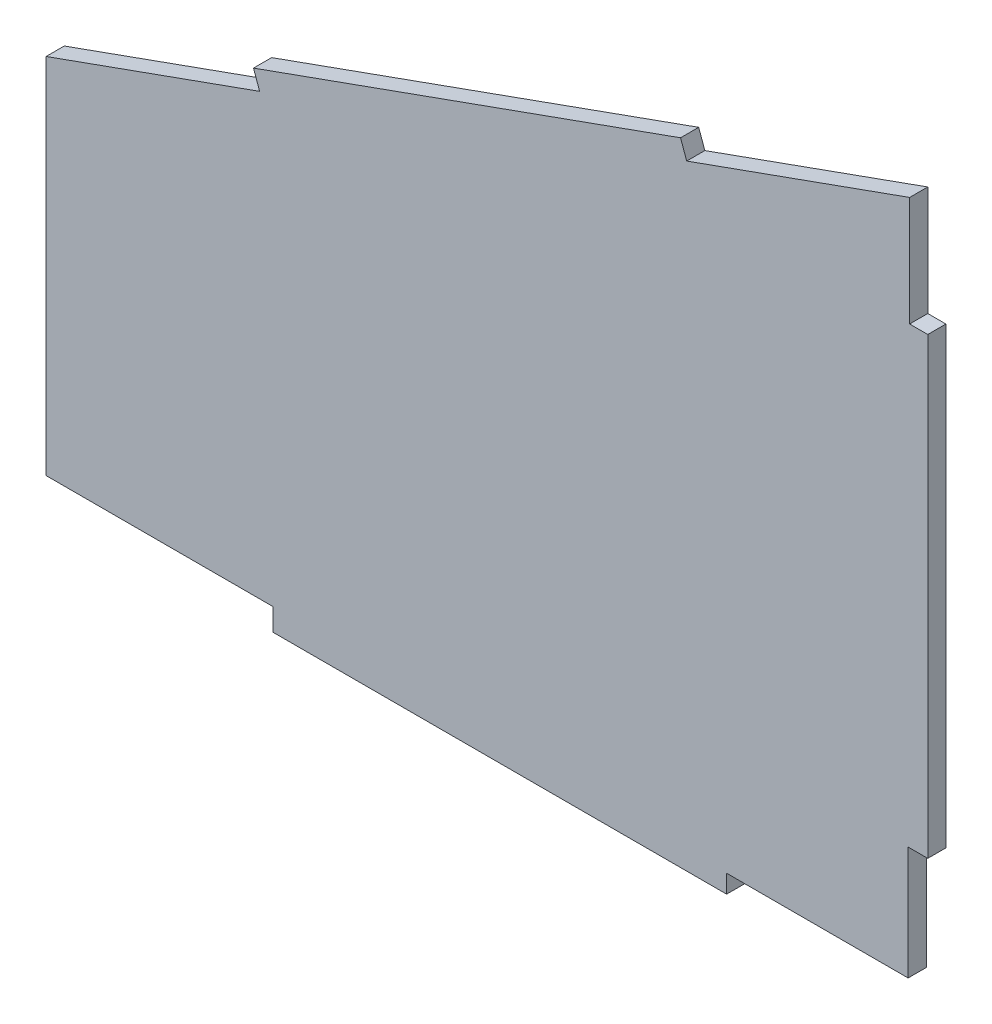
ISO-10303-21;
HEADER;
FILE_DESCRIPTION(('STEP AP214'),'2;1');
FILE_NAME('part.step','',(''),(''),'','','');
FILE_SCHEMA(('AUTOMOTIVE_DESIGN { 1 0 10303 214 1 1 1 1 }'));
ENDSEC;
DATA;
#1=APPLICATION_CONTEXT('core data for automotive mechanical design processes');
#2=APPLICATION_PROTOCOL_DEFINITION('international standard','automotive_design',2000,#1);
#3=PRODUCT_CONTEXT('',#1,'mechanical');
#4=PRODUCT('Part','Part','',(#3));
#5=PRODUCT_RELATED_PRODUCT_CATEGORY('part','',(#4));
#6=PRODUCT_DEFINITION_FORMATION('','',#4);
#7=PRODUCT_DEFINITION_CONTEXT('part definition',#1,'design');
#8=PRODUCT_DEFINITION('design','',#6,#7);
#9=PRODUCT_DEFINITION_SHAPE('','',#8);
#10=(LENGTH_UNIT() NAMED_UNIT(*) SI_UNIT(.MILLI.,.METRE.));
#11=(NAMED_UNIT(*) PLANE_ANGLE_UNIT() SI_UNIT($,.RADIAN.));
#12=(NAMED_UNIT(*) SI_UNIT($,.STERADIAN.) SOLID_ANGLE_UNIT());
#13=UNCERTAINTY_MEASURE_WITH_UNIT(LENGTH_MEASURE(1.E-05),#10,'distance_accuracy_value','');
#14=(GEOMETRIC_REPRESENTATION_CONTEXT(3) GLOBAL_UNCERTAINTY_ASSIGNED_CONTEXT((#13)) GLOBAL_UNIT_ASSIGNED_CONTEXT((#10,
#11,#12)) REPRESENTATION_CONTEXT('',''));
#15=CARTESIAN_POINT('',(0.,0.,0.));
#16=DIRECTION('',(0.,0.,1.));
#17=DIRECTION('',(1.,0.,0.));
#18=AXIS2_PLACEMENT_3D('',#15,#16,#17);
#19=CARTESIAN_POINT('',(-41.4083095907315,11.0698668127962,2.));
#20=DIRECTION('',(0.3375865479723,-0.94129449304038,0.));
#21=DIRECTION('',(0.94129449304038,0.3375865479723,0.));
#22=AXIS2_PLACEMENT_3D('',#19,#20,#21);
#23=PLANE('',#22);
#24=DIRECTION('',(-0.94129449304038,-0.3375865479723,0.));
#25=VECTOR('',#24,1.);
#26=CARTESIAN_POINT('',(-41.4083095907315,11.0698668127962,0.));
#27=LINE('',#26,#25);
#28=CARTESIAN_POINT('',(-41.4083095907315,11.0698668127962,0.));
#29=VERTEX_POINT('',#28);
#30=CARTESIAN_POINT('',(-64.9406719167412,2.63020311348861,0.));
#31=VERTEX_POINT('',#30);
#32=EDGE_CURVE('E180',#29,#31,#27,.T.);
#33=ORIENTED_EDGE('',*,*,#32,.T.);
#34=DIRECTION('',(0.,0.,-1.));
#35=VECTOR('',#34,1.);
#36=CARTESIAN_POINT('',(-64.9406719167412,2.63020311348861,2.));
#37=LINE('',#36,#35);
#38=CARTESIAN_POINT('',(-64.9406719167412,2.63020311348861,2.));
#39=VERTEX_POINT('',#38);
#40=EDGE_CURVE('E11',#39,#31,#37,.T.);
#41=ORIENTED_EDGE('',*,*,#40,.F.);
#42=DIRECTION('',(-0.94129449304038,-0.3375865479723,0.));
#43=VECTOR('',#42,1.);
#44=CARTESIAN_POINT('',(-41.4083095907315,11.0698668127962,2.));
#45=LINE('',#44,#43);
#46=CARTESIAN_POINT('',(-41.4083095907315,11.0698668127962,2.));
#47=VERTEX_POINT('',#46);
#48=EDGE_CURVE('E210',#47,#39,#45,.T.);
#49=ORIENTED_EDGE('',*,*,#48,.F.);
#50=DIRECTION('',(0.,0.,-1.));
#51=VECTOR('',#50,1.);
#52=CARTESIAN_POINT('',(-41.4083095907315,11.0698668127962,2.));
#53=LINE('',#52,#51);
#54=EDGE_CURVE('E176',#47,#29,#53,.T.);
#55=ORIENTED_EDGE('',*,*,#54,.T.);
#56=EDGE_LOOP('',(#33,#41,#49,#55));
#57=FACE_BOUND('',#56,.T.);
#58=ADVANCED_FACE('F36',(#57),#23,.F.);
#59=CARTESIAN_POINT('',(-64.9406719167412,2.63020311348861,2.));
#60=DIRECTION('',(1.,0.,0.));
#61=DIRECTION('',(0.,1.,0.));
#62=AXIS2_PLACEMENT_3D('',#59,#60,#61);
#63=PLANE('',#62);
#64=DIRECTION('',(0.,-1.,0.));
#65=VECTOR('',#64,1.);
#66=CARTESIAN_POINT('',(-64.9406719167412,2.63020311348861,0.));
#67=LINE('',#66,#65);
#68=CARTESIAN_POINT('',(-64.9406719167411,-37.3697968865117,0.));
#69=VERTEX_POINT('',#68);
#70=EDGE_CURVE('E183',#31,#69,#67,.T.);
#71=ORIENTED_EDGE('',*,*,#70,.T.);
#72=DIRECTION('',(0.,0.,-1.));
#73=VECTOR('',#72,1.);
#74=CARTESIAN_POINT('',(-64.9406719167411,-37.3697968865117,2.));
#75=LINE('',#74,#73);
#76=CARTESIAN_POINT('',(-64.9406719167411,-37.3697968865117,2.));
#77=VERTEX_POINT('',#76);
#78=EDGE_CURVE('E44',#77,#69,#75,.T.);
#79=ORIENTED_EDGE('',*,*,#78,.F.);
#80=DIRECTION('',(0.,-1.,0.));
#81=VECTOR('',#80,1.);
#82=CARTESIAN_POINT('',(-64.9406719167412,2.63020311348861,2.));
#83=LINE('',#82,#81);
#84=EDGE_CURVE('E119',#39,#77,#83,.T.);
#85=ORIENTED_EDGE('',*,*,#84,.F.);
#86=ORIENTED_EDGE('',*,*,#40,.T.);
#87=EDGE_LOOP('',(#71,#79,#85,#86));
#88=FACE_BOUND('',#87,.T.);
#89=ADVANCED_FACE('F308',(#88),#63,.F.);
#90=CARTESIAN_POINT('',(-64.9406719167411,-37.3697968865117,2.));
#91=DIRECTION('',(0.,1.,0.));
#92=DIRECTION('',(-1.,0.,0.));
#93=AXIS2_PLACEMENT_3D('',#90,#91,#92);
#94=PLANE('',#93);
#95=DIRECTION('',(1.,0.,0.));
#96=VECTOR('',#95,1.);
#97=CARTESIAN_POINT('',(-64.9406719167411,-37.3697968865117,0.));
#98=LINE('',#97,#96);
#99=CARTESIAN_POINT('',(-39.940671916741,-37.3697968865117,0.));
#100=VERTEX_POINT('',#99);
#101=EDGE_CURVE('E185',#69,#100,#98,.T.);
#102=ORIENTED_EDGE('',*,*,#101,.T.);
#103=DIRECTION('',(0.,0.,-1.));
#104=VECTOR('',#103,1.);
#105=CARTESIAN_POINT('',(-39.940671916741,-37.3697968865117,2.));
#106=LINE('',#105,#104);
#107=CARTESIAN_POINT('',(-39.940671916741,-37.3697968865117,2.));
#108=VERTEX_POINT('',#107);
#109=EDGE_CURVE('E241',#108,#100,#106,.T.);
#110=ORIENTED_EDGE('',*,*,#109,.F.);
#111=DIRECTION('',(1.,0.,0.));
#112=VECTOR('',#111,1.);
#113=CARTESIAN_POINT('',(-64.9406719167411,-37.3697968865117,2.));
#114=LINE('',#113,#112);
#115=EDGE_CURVE('E249',#77,#108,#114,.T.);
#116=ORIENTED_EDGE('',*,*,#115,.F.);
#117=ORIENTED_EDGE('',*,*,#78,.T.);
#118=EDGE_LOOP('',(#102,#110,#116,#117));
#119=FACE_BOUND('',#118,.T.);
#120=ADVANCED_FACE('F247',(#119),#94,.F.);
#121=CARTESIAN_POINT('',(-39.940671916741,-37.3697968865117,2.));
#122=DIRECTION('',(1.,0.,0.));
#123=DIRECTION('',(0.,1.,0.));
#124=AXIS2_PLACEMENT_3D('',#121,#122,#123);
#125=PLANE('',#124);
#126=DIRECTION('',(0.,-1.,0.));
#127=VECTOR('',#126,1.);
#128=CARTESIAN_POINT('',(-39.940671916741,-37.3697968865117,0.));
#129=LINE('',#128,#127);
#130=CARTESIAN_POINT('',(-39.940671916741,-39.8197968865117,0.));
#131=VERTEX_POINT('',#130);
#132=EDGE_CURVE('E187',#100,#131,#129,.T.);
#133=ORIENTED_EDGE('',*,*,#132,.T.);
#134=DIRECTION('',(0.,0.,-1.));
#135=VECTOR('',#134,1.);
#136=CARTESIAN_POINT('',(-39.940671916741,-39.8197968865117,2.));
#137=LINE('',#136,#135);
#138=CARTESIAN_POINT('',(-39.940671916741,-39.8197968865117,2.));
#139=VERTEX_POINT('',#138);
#140=EDGE_CURVE('E238',#139,#131,#137,.T.);
#141=ORIENTED_EDGE('',*,*,#140,.F.);
#142=DIRECTION('',(0.,-1.,0.));
#143=VECTOR('',#142,1.);
#144=CARTESIAN_POINT('',(-39.940671916741,-37.3697968865117,2.));
#145=LINE('',#144,#143);
#146=EDGE_CURVE('E267',#108,#139,#145,.T.);
#147=ORIENTED_EDGE('',*,*,#146,.F.);
#148=ORIENTED_EDGE('',*,*,#109,.T.);
#149=EDGE_LOOP('',(#133,#141,#147,#148));
#150=FACE_BOUND('',#149,.T.);
#151=ADVANCED_FACE('F258',(#150),#125,.F.);
#152=CARTESIAN_POINT('',(-39.940671916741,-39.8197968865117,2.));
#153=DIRECTION('',(0.,1.,0.));
#154=DIRECTION('',(0.,0.,1.));
#155=AXIS2_PLACEMENT_3D('',#152,#153,#154);
#156=PLANE('',#155);
#157=DIRECTION('',(1.,0.,0.));
#158=VECTOR('',#157,1.);
#159=CARTESIAN_POINT('',(-39.940671916741,-39.8197968865117,0.));
#160=LINE('',#159,#158);
#161=CARTESIAN_POINT('',(10.059328083259,-39.8197968865117,0.));
#162=VERTEX_POINT('',#161);
#163=EDGE_CURVE('E189',#131,#162,#160,.T.);
#164=ORIENTED_EDGE('',*,*,#163,.T.);
#165=DIRECTION('',(0.,0.,-1.));
#166=VECTOR('',#165,1.);
#167=CARTESIAN_POINT('',(10.059328083259,-39.8197968865117,2.));
#168=LINE('',#167,#166);
#169=CARTESIAN_POINT('',(10.059328083259,-39.8197968865117,2.));
#170=VERTEX_POINT('',#169);
#171=EDGE_CURVE('E235',#170,#162,#168,.T.);
#172=ORIENTED_EDGE('',*,*,#171,.F.);
#173=DIRECTION('',(1.,0.,0.));
#174=VECTOR('',#173,1.);
#175=CARTESIAN_POINT('',(-39.940671916741,-39.8197968865117,2.));
#176=LINE('',#175,#174);
#177=EDGE_CURVE('E264',#139,#170,#176,.T.);
#178=ORIENTED_EDGE('',*,*,#177,.F.);
#179=ORIENTED_EDGE('',*,*,#140,.T.);
#180=EDGE_LOOP('',(#164,#172,#178,#179));
#181=FACE_BOUND('',#180,.T.);
#182=ADVANCED_FACE('F262',(#181),#156,.F.);
#183=CARTESIAN_POINT('',(10.059328083259,-37.8197968865117,2.));
#184=DIRECTION('',(-1.,0.,0.));
#185=DIRECTION('',(0.,0.,1.));
#186=AXIS2_PLACEMENT_3D('',#183,#184,#185);
#187=PLANE('',#186);
#188=DIRECTION('',(0.,1.,0.));
#189=VECTOR('',#188,1.);
#190=CARTESIAN_POINT('',(10.059328083259,-37.8197968865117,0.));
#191=LINE('',#190,#189);
#192=CARTESIAN_POINT('',(10.059328083259,-37.8197968865117,0.));
#193=VERTEX_POINT('',#192);
#194=EDGE_CURVE('E191',#162,#193,#191,.T.);
#195=ORIENTED_EDGE('',*,*,#194,.T.);
#196=DIRECTION('',(0.,0.,-1.));
#197=VECTOR('',#196,1.);
#198=CARTESIAN_POINT('',(10.059328083259,-37.8197968865117,2.));
#199=LINE('',#198,#197);
#200=CARTESIAN_POINT('',(10.059328083259,-37.8197968865117,2.));
#201=VERTEX_POINT('',#200);
#202=EDGE_CURVE('E232',#201,#193,#199,.T.);
#203=ORIENTED_EDGE('',*,*,#202,.F.);
#204=DIRECTION('',(0.,1.,0.));
#205=VECTOR('',#204,1.);
#206=CARTESIAN_POINT('',(10.059328083259,-37.8197968865117,2.));
#207=LINE('',#206,#205);
#208=EDGE_CURVE('E266',#170,#201,#207,.T.);
#209=ORIENTED_EDGE('',*,*,#208,.F.);
#210=ORIENTED_EDGE('',*,*,#171,.T.);
#211=EDGE_LOOP('',(#195,#203,#209,#210));
#212=FACE_BOUND('',#211,.T.);
#213=ADVANCED_FACE('F321',(#212),#187,.F.);
#214=CARTESIAN_POINT('',(10.059328083259,-37.8197968865117,2.));
#215=DIRECTION('',(0.,1.,0.));
#216=DIRECTION('',(-1.,0.,0.));
#217=AXIS2_PLACEMENT_3D('',#214,#215,#216);
#218=PLANE('',#217);
#219=DIRECTION('',(1.,0.,0.));
#220=VECTOR('',#219,1.);
#221=CARTESIAN_POINT('',(10.059328083259,-37.8197968865117,0.));
#222=LINE('',#221,#220);
#223=CARTESIAN_POINT('',(30.059328083259,-37.8197968865116,0.));
#224=VERTEX_POINT('',#223);
#225=EDGE_CURVE('E193',#193,#224,#222,.T.);
#226=ORIENTED_EDGE('',*,*,#225,.T.);
#227=DIRECTION('',(0.,0.,-1.));
#228=VECTOR('',#227,1.);
#229=CARTESIAN_POINT('',(30.059328083259,-37.8197968865116,2.));
#230=LINE('',#229,#228);
#231=CARTESIAN_POINT('',(30.059328083259,-37.8197968865116,2.));
#232=VERTEX_POINT('',#231);
#233=EDGE_CURVE('E229',#232,#224,#230,.T.);
#234=ORIENTED_EDGE('',*,*,#233,.F.);
#235=DIRECTION('',(1.,0.,0.));
#236=VECTOR('',#235,1.);
#237=CARTESIAN_POINT('',(10.059328083259,-37.8197968865117,2.));
#238=LINE('',#237,#236);
#239=EDGE_CURVE('E269',#201,#232,#238,.T.);
#240=ORIENTED_EDGE('',*,*,#239,.F.);
#241=ORIENTED_EDGE('',*,*,#202,.T.);
#242=EDGE_LOOP('',(#226,#234,#240,#241));
#243=FACE_BOUND('',#242,.T.);
#244=ADVANCED_FACE('F324',(#243),#218,.F.);
#245=CARTESIAN_POINT('',(30.059328083259,-37.8197968865116,2.));
#246=DIRECTION('',(-1.,0.,0.));
#247=DIRECTION('',(0.,-1.,0.));
#248=AXIS2_PLACEMENT_3D('',#245,#246,#247);
#249=PLANE('',#248);
#250=DIRECTION('',(0.,1.,0.));
#251=VECTOR('',#250,1.);
#252=CARTESIAN_POINT('',(30.059328083259,-37.8197968865116,0.));
#253=LINE('',#252,#251);
#254=CARTESIAN_POINT('',(30.059328083259,-25.3197968865116,0.));
#255=VERTEX_POINT('',#254);
#256=EDGE_CURVE('E195',#224,#255,#253,.T.);
#257=ORIENTED_EDGE('',*,*,#256,.T.);
#258=DIRECTION('',(0.,0.,-1.));
#259=VECTOR('',#258,1.);
#260=CARTESIAN_POINT('',(30.059328083259,-25.3197968865116,2.));
#261=LINE('',#260,#259);
#262=CARTESIAN_POINT('',(30.059328083259,-25.3197968865116,2.));
#263=VERTEX_POINT('',#262);
#264=EDGE_CURVE('E226',#263,#255,#261,.T.);
#265=ORIENTED_EDGE('',*,*,#264,.F.);
#266=DIRECTION('',(0.,1.,0.));
#267=VECTOR('',#266,1.);
#268=CARTESIAN_POINT('',(30.059328083259,-37.8197968865116,2.));
#269=LINE('',#268,#267);
#270=EDGE_CURVE('E275',#232,#263,#269,.T.);
#271=ORIENTED_EDGE('',*,*,#270,.F.);
#272=ORIENTED_EDGE('',*,*,#233,.T.);
#273=EDGE_LOOP('',(#257,#265,#271,#272));
#274=FACE_BOUND('',#273,.T.);
#275=ADVANCED_FACE('F328',(#274),#249,.F.);
#276=CARTESIAN_POINT('',(30.059328083259,-25.3197968865116,2.));
#277=DIRECTION('',(0.,1.,0.));
#278=DIRECTION('',(-1.,0.,0.));
#279=AXIS2_PLACEMENT_3D('',#276,#277,#278);
#280=PLANE('',#279);
#281=DIRECTION('',(1.,0.,0.));
#282=VECTOR('',#281,1.);
#283=CARTESIAN_POINT('',(30.059328083259,-25.3197968865116,0.));
#284=LINE('',#283,#282);
#285=CARTESIAN_POINT('',(32.2242013296412,-25.3197968865116,0.));
#286=VERTEX_POINT('',#285);
#287=EDGE_CURVE('E197',#255,#286,#284,.T.);
#288=ORIENTED_EDGE('',*,*,#287,.T.);
#289=DIRECTION('',(0.,0.,-1.));
#290=VECTOR('',#289,1.);
#291=CARTESIAN_POINT('',(32.2242013296412,-25.3197968865116,2.));
#292=LINE('',#291,#290);
#293=CARTESIAN_POINT('',(32.2242013296412,-25.3197968865116,2.));
#294=VERTEX_POINT('',#293);
#295=EDGE_CURVE('E223',#294,#286,#292,.T.);
#296=ORIENTED_EDGE('',*,*,#295,.F.);
#297=DIRECTION('',(1.,0.,0.));
#298=VECTOR('',#297,1.);
#299=CARTESIAN_POINT('',(30.059328083259,-25.3197968865116,2.));
#300=LINE('',#299,#298);
#301=EDGE_CURVE('E277',#263,#294,#300,.T.);
#302=ORIENTED_EDGE('',*,*,#301,.F.);
#303=ORIENTED_EDGE('',*,*,#264,.T.);
#304=EDGE_LOOP('',(#288,#296,#302,#303));
#305=FACE_BOUND('',#304,.T.);
#306=ADVANCED_FACE('F332',(#305),#280,.F.);
#307=CARTESIAN_POINT('',(32.2242013296412,24.6802031134884,2.));
#308=DIRECTION('',(-1.,0.,0.));
#309=DIRECTION('',(0.,-1.,0.));
#310=AXIS2_PLACEMENT_3D('',#307,#308,#309);
#311=PLANE('',#310);
#312=DIRECTION('',(0.,1.,0.));
#313=VECTOR('',#312,1.);
#314=CARTESIAN_POINT('',(32.2242013296412,24.6802031134884,0.));
#315=LINE('',#314,#313);
#316=CARTESIAN_POINT('',(32.2242013296412,24.6802031134884,0.));
#317=VERTEX_POINT('',#316);
#318=EDGE_CURVE('E199',#286,#317,#315,.T.);
#319=ORIENTED_EDGE('',*,*,#318,.T.);
#320=DIRECTION('',(0.,0.,-1.));
#321=VECTOR('',#320,1.);
#322=CARTESIAN_POINT('',(32.2242013296412,24.6802031134884,2.));
#323=LINE('',#322,#321);
#324=CARTESIAN_POINT('',(32.2242013296412,24.6802031134884,2.));
#325=VERTEX_POINT('',#324);
#326=EDGE_CURVE('E220',#325,#317,#323,.T.);
#327=ORIENTED_EDGE('',*,*,#326,.F.);
#328=DIRECTION('',(0.,1.,0.));
#329=VECTOR('',#328,1.);
#330=CARTESIAN_POINT('',(32.2242013296412,24.6802031134884,2.));
#331=LINE('',#330,#329);
#332=EDGE_CURVE('E279',#294,#325,#331,.T.);
#333=ORIENTED_EDGE('',*,*,#332,.F.);
#334=ORIENTED_EDGE('',*,*,#295,.T.);
#335=EDGE_LOOP('',(#319,#327,#333,#334));
#336=FACE_BOUND('',#335,.T.);
#337=ADVANCED_FACE('F336',(#336),#311,.F.);
#338=CARTESIAN_POINT('',(30.2242013296412,24.6802031134884,2.));
#339=DIRECTION('',(0.,-1.,0.));
#340=DIRECTION('',(0.,0.,-1.));
#341=AXIS2_PLACEMENT_3D('',#338,#339,#340);
#342=PLANE('',#341);
#343=DIRECTION('',(-1.,0.,0.));
#344=VECTOR('',#343,1.);
#345=CARTESIAN_POINT('',(30.2242013296412,24.6802031134884,0.));
#346=LINE('',#345,#344);
#347=CARTESIAN_POINT('',(30.2242013296412,24.6802031134884,0.));
#348=VERTEX_POINT('',#347);
#349=EDGE_CURVE('E201',#317,#348,#346,.T.);
#350=ORIENTED_EDGE('',*,*,#349,.T.);
#351=DIRECTION('',(0.,0.,-1.));
#352=VECTOR('',#351,1.);
#353=CARTESIAN_POINT('',(30.2242013296412,24.6802031134884,2.));
#354=LINE('',#353,#352);
#355=CARTESIAN_POINT('',(30.2242013296412,24.6802031134884,2.));
#356=VERTEX_POINT('',#355);
#357=EDGE_CURVE('E217',#356,#348,#354,.T.);
#358=ORIENTED_EDGE('',*,*,#357,.F.);
#359=DIRECTION('',(-1.,0.,0.));
#360=VECTOR('',#359,1.);
#361=CARTESIAN_POINT('',(30.2242013296412,24.6802031134884,2.));
#362=LINE('',#361,#360);
#363=EDGE_CURVE('E281',#325,#356,#362,.T.);
#364=ORIENTED_EDGE('',*,*,#363,.F.);
#365=ORIENTED_EDGE('',*,*,#326,.T.);
#366=EDGE_LOOP('',(#350,#358,#364,#365));
#367=FACE_BOUND('',#366,.T.);
#368=ADVANCED_FACE('F340',(#367),#342,.F.);
#369=CARTESIAN_POINT('',(30.2242013296412,24.6802031134884,2.));
#370=DIRECTION('',(-1.,0.,0.));
#371=DIRECTION('',(0.,0.,1.));
#372=AXIS2_PLACEMENT_3D('',#369,#370,#371);
#373=PLANE('',#372);
#374=DIRECTION('',(0.,1.,0.));
#375=VECTOR('',#374,1.);
#376=CARTESIAN_POINT('',(30.2242013296412,24.6802031134884,0.));
#377=LINE('',#376,#375);
#378=CARTESIAN_POINT('',(30.2242013296412,36.7602031134884,0.));
#379=VERTEX_POINT('',#378);
#380=EDGE_CURVE('E203',#348,#379,#377,.T.);
#381=ORIENTED_EDGE('',*,*,#380,.T.);
#382=DIRECTION('',(0.,0.,-1.));
#383=VECTOR('',#382,1.);
#384=CARTESIAN_POINT('',(30.2242013296412,36.7602031134884,2.));
#385=LINE('',#384,#383);
#386=CARTESIAN_POINT('',(30.2242013296412,36.7602031134884,2.));
#387=VERTEX_POINT('',#386);
#388=EDGE_CURVE('E214',#387,#379,#385,.T.);
#389=ORIENTED_EDGE('',*,*,#388,.F.);
#390=DIRECTION('',(0.,1.,0.));
#391=VECTOR('',#390,1.);
#392=CARTESIAN_POINT('',(30.2242013296412,24.6802031134884,2.));
#393=LINE('',#392,#391);
#394=EDGE_CURVE('E283',#356,#387,#393,.T.);
#395=ORIENTED_EDGE('',*,*,#394,.F.);
#396=ORIENTED_EDGE('',*,*,#357,.T.);
#397=EDGE_LOOP('',(#381,#389,#395,#396));
#398=FACE_BOUND('',#397,.T.);
#399=ADVANCED_FACE('F289',(#398),#373,.F.);
#400=CARTESIAN_POINT('',(30.2242013296412,36.7602031134884,2.));
#401=DIRECTION('',(0.337586547972305,-0.941294493040378,0.));
#402=DIRECTION('',(0.941294493040378,0.337586547972305,0.));
#403=AXIS2_PLACEMENT_3D('',#400,#401,#402);
#404=PLANE('',#403);
#405=DIRECTION('',(-0.941294493040378,-0.337586547972305,0.));
#406=VECTOR('',#405,1.);
#407=CARTESIAN_POINT('',(30.2242013296412,36.7602031134884,0.));
#408=LINE('',#407,#406);
#409=CARTESIAN_POINT('',(5.65641506128749,27.9491942114112,0.));
#410=VERTEX_POINT('',#409);
#411=EDGE_CURVE('E205',#379,#410,#408,.T.);
#412=ORIENTED_EDGE('',*,*,#411,.T.);
#413=DIRECTION('',(0.,0.,-1.));
#414=VECTOR('',#413,1.);
#415=CARTESIAN_POINT('',(5.65641506128749,27.9491942114112,2.));
#416=LINE('',#415,#414);
#417=CARTESIAN_POINT('',(5.65641506128749,27.9491942114112,2.));
#418=VERTEX_POINT('',#417);
#419=EDGE_CURVE('E171',#418,#410,#416,.T.);
#420=ORIENTED_EDGE('',*,*,#419,.F.);
#421=DIRECTION('',(-0.941294493040378,-0.337586547972305,0.));
#422=VECTOR('',#421,1.);
#423=CARTESIAN_POINT('',(30.2242013296412,36.7602031134884,2.));
#424=LINE('',#423,#422);
#425=EDGE_CURVE('E162',#387,#418,#424,.T.);
#426=ORIENTED_EDGE('',*,*,#425,.F.);
#427=ORIENTED_EDGE('',*,*,#388,.T.);
#428=EDGE_LOOP('',(#412,#420,#426,#427));
#429=FACE_BOUND('',#428,.T.);
#430=ADVANCED_FACE('F293',(#429),#404,.F.);
#431=CARTESIAN_POINT('',(5.65641506128749,27.9491942114112,2.));
#432=DIRECTION('',(-0.94129449304039,-0.337586547972273,0.));
#433=DIRECTION('',(0.337586547972273,-0.94129449304039,0.));
#434=AXIS2_PLACEMENT_3D('',#431,#432,#433);
#435=PLANE('',#434);
#436=DIRECTION('',(-0.337586547972273,0.94129449304039,0.));
#437=VECTOR('',#436,1.);
#438=CARTESIAN_POINT('',(5.65641506128749,27.9491942114112,0.));
#439=LINE('',#438,#437);
#440=CARTESIAN_POINT('',(4.98124196534296,29.831783197492,0.));
#441=VERTEX_POINT('',#440);
#442=EDGE_CURVE('E170',#410,#441,#439,.T.);
#443=ORIENTED_EDGE('',*,*,#442,.T.);
#444=DIRECTION('',(0.,0.,-1.));
#445=VECTOR('',#444,1.);
#446=CARTESIAN_POINT('',(4.98124196534296,29.831783197492,2.));
#447=LINE('',#446,#445);
#448=CARTESIAN_POINT('',(4.98124196534296,29.831783197492,2.));
#449=VERTEX_POINT('',#448);
#450=EDGE_CURVE('E167',#449,#441,#447,.T.);
#451=ORIENTED_EDGE('',*,*,#450,.F.);
#452=DIRECTION('',(-0.337586547972273,0.94129449304039,0.));
#453=VECTOR('',#452,1.);
#454=CARTESIAN_POINT('',(5.65641506128749,27.9491942114112,2.));
#455=LINE('',#454,#453);
#456=EDGE_CURVE('E156',#418,#449,#455,.T.);
#457=ORIENTED_EDGE('',*,*,#456,.F.);
#458=ORIENTED_EDGE('',*,*,#419,.T.);
#459=EDGE_LOOP('',(#443,#451,#457,#458));
#460=FACE_BOUND('',#459,.T.);
#461=ADVANCED_FACE('F168',(#460),#435,.F.);
#462=CARTESIAN_POINT('',(-42.0834826866761,12.9524557988769,2.));
#463=DIRECTION('',(0.337586547972301,-0.94129449304038,0.));
#464=DIRECTION('',(0.94129449304038,0.337586547972301,0.));
#465=AXIS2_PLACEMENT_3D('',#462,#463,#464);
#466=PLANE('',#465);
#467=DIRECTION('',(-0.94129449304038,-0.337586547972301,0.));
#468=VECTOR('',#467,1.);
#469=CARTESIAN_POINT('',(-42.0834826866761,12.9524557988769,0.));
#470=LINE('',#469,#468);
#471=CARTESIAN_POINT('',(-42.0834826866761,12.9524557988769,0.));
#472=VERTEX_POINT('',#471);
#473=EDGE_CURVE('E105',#441,#472,#470,.T.);
#474=ORIENTED_EDGE('',*,*,#473,.T.);
#475=DIRECTION('',(0.,0.,-1.));
#476=VECTOR('',#475,1.);
#477=CARTESIAN_POINT('',(-42.0834826866761,12.9524557988769,2.));
#478=LINE('',#477,#476);
#479=CARTESIAN_POINT('',(-42.0834826866761,12.9524557988769,2.));
#480=VERTEX_POINT('',#479);
#481=EDGE_CURVE('E172',#480,#472,#478,.T.);
#482=ORIENTED_EDGE('',*,*,#481,.F.);
#483=DIRECTION('',(-0.94129449304038,-0.337586547972301,0.));
#484=VECTOR('',#483,1.);
#485=CARTESIAN_POINT('',(-42.0834826866761,12.9524557988769,2.));
#486=LINE('',#485,#484);
#487=EDGE_CURVE('E160',#449,#480,#486,.T.);
#488=ORIENTED_EDGE('',*,*,#487,.F.);
#489=ORIENTED_EDGE('',*,*,#450,.T.);
#490=EDGE_LOOP('',(#474,#482,#488,#489));
#491=FACE_BOUND('',#490,.T.);
#492=ADVANCED_FACE('F174',(#491),#466,.F.);
#493=CARTESIAN_POINT('',(-41.4083095907315,11.0698668127962,2.));
#494=DIRECTION('',(0.941294493040382,0.337586547972295,0.));
#495=DIRECTION('',(-0.337586547972295,0.941294493040382,0.));
#496=AXIS2_PLACEMENT_3D('',#493,#494,#495);
#497=PLANE('',#496);
#498=DIRECTION('',(0.337586547972295,-0.941294493040382,0.));
#499=VECTOR('',#498,1.);
#500=CARTESIAN_POINT('',(-41.4083095907315,11.0698668127962,0.));
#501=LINE('',#500,#499);
#502=EDGE_CURVE('E111',#472,#29,#501,.T.);
#503=ORIENTED_EDGE('',*,*,#502,.T.);
#504=ORIENTED_EDGE('',*,*,#54,.F.);
#505=DIRECTION('',(0.337586547972295,-0.941294493040382,0.));
#506=VECTOR('',#505,1.);
#507=CARTESIAN_POINT('',(-41.4083095907315,11.0698668127962,2.));
#508=LINE('',#507,#506);
#509=EDGE_CURVE('E52',#480,#47,#508,.T.);
#510=ORIENTED_EDGE('',*,*,#509,.F.);
#511=ORIENTED_EDGE('',*,*,#481,.T.);
#512=EDGE_LOOP('',(#503,#504,#510,#511));
#513=FACE_BOUND('',#512,.T.);
#514=ADVANCED_FACE('F297',(#513),#497,.F.);
#515=CARTESIAN_POINT('',(0.,0.,2.));
#516=DIRECTION('',(0.,0.,-1.));
#517=DIRECTION('',(-1.,0.,0.));
#518=AXIS2_PLACEMENT_3D('',#515,#516,#517);
#519=PLANE('',#518);
#520=ORIENTED_EDGE('',*,*,#48,.T.);
#521=ORIENTED_EDGE('',*,*,#84,.T.);
#522=ORIENTED_EDGE('',*,*,#115,.T.);
#523=ORIENTED_EDGE('',*,*,#146,.T.);
#524=ORIENTED_EDGE('',*,*,#177,.T.);
#525=ORIENTED_EDGE('',*,*,#208,.T.);
#526=ORIENTED_EDGE('',*,*,#239,.T.);
#527=ORIENTED_EDGE('',*,*,#270,.T.);
#528=ORIENTED_EDGE('',*,*,#301,.T.);
#529=ORIENTED_EDGE('',*,*,#332,.T.);
#530=ORIENTED_EDGE('',*,*,#363,.T.);
#531=ORIENTED_EDGE('',*,*,#394,.T.);
#532=ORIENTED_EDGE('',*,*,#425,.T.);
#533=ORIENTED_EDGE('',*,*,#456,.T.);
#534=ORIENTED_EDGE('',*,*,#487,.T.);
#535=ORIENTED_EDGE('',*,*,#509,.T.);
#536=EDGE_LOOP('',(#520,#521,#522,#523,#524,#525,#526,#527,#528,#529,#530,#531,#532,#533,#534,#535));
#537=FACE_BOUND('',#536,.T.);
#538=ADVANCED_FACE('F158',(#537),#519,.F.);
#539=CARTESIAN_POINT('',(0.,0.,0.));
#540=DIRECTION('',(0.,0.,-1.));
#541=DIRECTION('',(-1.,0.,0.));
#542=AXIS2_PLACEMENT_3D('',#539,#540,#541);
#543=PLANE('',#542);
#544=ORIENTED_EDGE('',*,*,#32,.F.);
#545=ORIENTED_EDGE('',*,*,#502,.F.);
#546=ORIENTED_EDGE('',*,*,#473,.F.);
#547=ORIENTED_EDGE('',*,*,#442,.F.);
#548=ORIENTED_EDGE('',*,*,#411,.F.);
#549=ORIENTED_EDGE('',*,*,#380,.F.);
#550=ORIENTED_EDGE('',*,*,#349,.F.);
#551=ORIENTED_EDGE('',*,*,#318,.F.);
#552=ORIENTED_EDGE('',*,*,#287,.F.);
#553=ORIENTED_EDGE('',*,*,#256,.F.);
#554=ORIENTED_EDGE('',*,*,#225,.F.);
#555=ORIENTED_EDGE('',*,*,#194,.F.);
#556=ORIENTED_EDGE('',*,*,#163,.F.);
#557=ORIENTED_EDGE('',*,*,#132,.F.);
#558=ORIENTED_EDGE('',*,*,#101,.F.);
#559=ORIENTED_EDGE('',*,*,#70,.F.);
#560=EDGE_LOOP('',(#544,#545,#546,#547,#548,#549,#550,#551,#552,#553,#554,#555,#556,#557,#558,#559));
#561=FACE_BOUND('',#560,.T.);
#562=ADVANCED_FACE('F253',(#561),#543,.T.);
#563=CLOSED_SHELL('',(#58,#89,#120,#151,#182,#213,#244,#275,#306,#337,#368,#399,#430,#461,#492,
#514,#538,#562));
#564=MANIFOLD_SOLID_BREP('B2',#563);
#565=ADVANCED_BREP_SHAPE_REPRESENTATION('',(#18,#564),#14);
#566=SHAPE_DEFINITION_REPRESENTATION(#9,#565);
ENDSEC;
END-ISO-10303-21;
